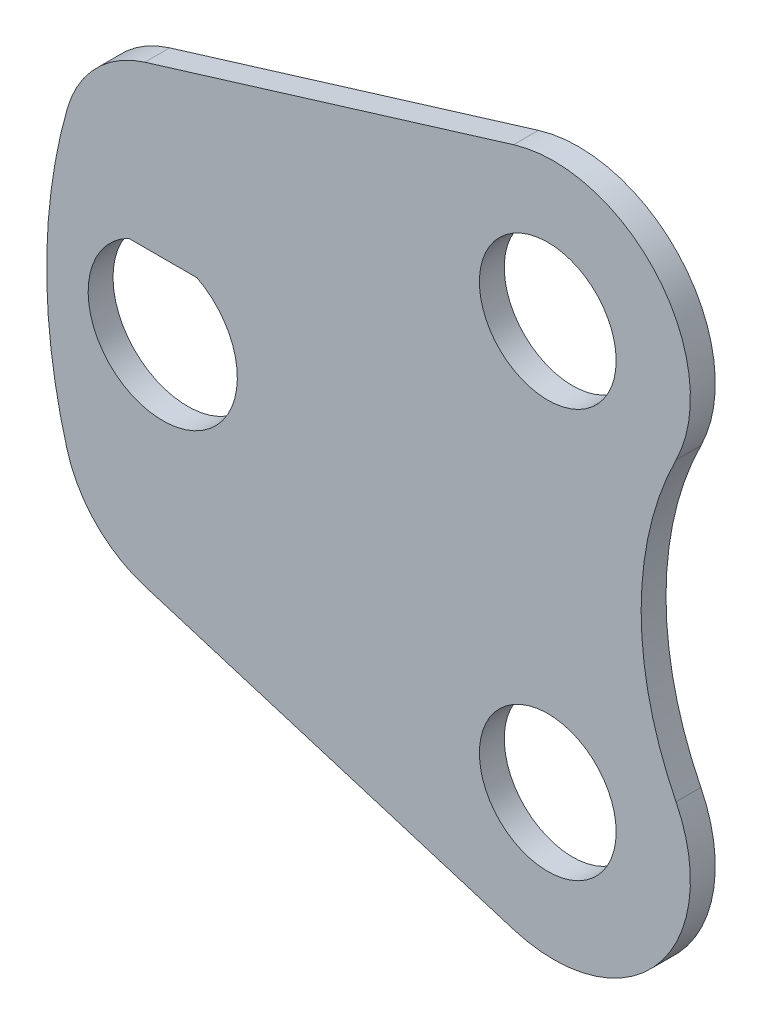
ISO-10303-21;
HEADER;
FILE_DESCRIPTION(('STEP AP214'),'2;1');
FILE_NAME('part.step','',(''),(''),'','','');
FILE_SCHEMA(('AUTOMOTIVE_DESIGN { 1 0 10303 214 1 1 1 1 }'));
ENDSEC;
DATA;
#1=APPLICATION_CONTEXT('core data for automotive mechanical design processes');
#2=APPLICATION_PROTOCOL_DEFINITION('international standard','automotive_design',2000,#1);
#3=PRODUCT_CONTEXT('',#1,'mechanical');
#4=PRODUCT('Part','Part','',(#3));
#5=PRODUCT_RELATED_PRODUCT_CATEGORY('part','',(#4));
#6=PRODUCT_DEFINITION_FORMATION('','',#4);
#7=PRODUCT_DEFINITION_CONTEXT('part definition',#1,'design');
#8=PRODUCT_DEFINITION('design','',#6,#7);
#9=PRODUCT_DEFINITION_SHAPE('','',#8);
#10=(LENGTH_UNIT() NAMED_UNIT(*) SI_UNIT(.MILLI.,.METRE.));
#11=(NAMED_UNIT(*) PLANE_ANGLE_UNIT() SI_UNIT($,.RADIAN.));
#12=(NAMED_UNIT(*) SI_UNIT($,.STERADIAN.) SOLID_ANGLE_UNIT());
#13=UNCERTAINTY_MEASURE_WITH_UNIT(LENGTH_MEASURE(1.E-05),#10,'distance_accuracy_value','');
#14=(GEOMETRIC_REPRESENTATION_CONTEXT(3) GLOBAL_UNCERTAINTY_ASSIGNED_CONTEXT((#13)) GLOBAL_UNIT_ASSIGNED_CONTEXT((#10,
#11,#12)) REPRESENTATION_CONTEXT('',''));
#15=CARTESIAN_POINT('',(0.,0.,0.));
#16=DIRECTION('',(0.,0.,1.));
#17=DIRECTION('',(1.,0.,0.));
#18=AXIS2_PLACEMENT_3D('',#15,#16,#17);
#19=CARTESIAN_POINT('',(-2.17060222083509,-12.6116644131444,1.49999999999999));
#20=DIRECTION('',(0.,0.,1.));
#21=DIRECTION('',(1.,0.,0.));
#22=AXIS2_PLACEMENT_3D('',#19,#20,#21);
#23=PLANE('',#22);
#24=CARTESIAN_POINT('',(-2.52417284795119,-12.3099999999997,1.49999999999999));
#25=DIRECTION('',(0.,0.,1.));
#26=DIRECTION('',(1.,0.,0.));
#27=AXIS2_PLACEMENT_3D('',#24,#25,#26);
#28=CIRCLE('',#27,4.125);
#29=CARTESIAN_POINT('',(1.60082715204881,-12.3099999999997,1.49999999999999));
#30=VERTEX_POINT('',#29);
#31=EDGE_CURVE('E140',#30,#30,#28,.T.);
#32=ORIENTED_EDGE('',*,*,#31,.F.);
#33=EDGE_LOOP('',(#32));
#34=FACE_BOUND('',#33,.T.);
#35=CARTESIAN_POINT('',(-2.52417284795097,12.3099999999992,1.5));
#36=DIRECTION('',(0.,0.,1.));
#37=DIRECTION('',(1.,0.,0.));
#38=AXIS2_PLACEMENT_3D('',#35,#36,#37);
#39=CIRCLE('',#38,4.125);
#40=CARTESIAN_POINT('',(1.60082715204903,12.3099999999992,1.5));
#41=VERTEX_POINT('',#40);
#42=EDGE_CURVE('E200',#41,#41,#39,.T.);
#43=ORIENTED_EDGE('',*,*,#42,.F.);
#44=EDGE_LOOP('',(#43));
#45=FACE_BOUND('',#44,.T.);
#46=CARTESIAN_POINT('',(-2.17060222083509,-12.6116644131444,1.49999999999999));
#47=DIRECTION('',(0.,0.,1.));
#48=DIRECTION('',(1.,0.,0.));
#49=AXIS2_PLACEMENT_3D('',#46,#47,#48);
#50=CIRCLE('',#49,8.25000000000008);
#51=CARTESIAN_POINT('',(-4.5865206112494,-20.5000000000005,1.5));
#52=VERTEX_POINT('',#51);
#53=CARTESIAN_POINT('',(5.21164843393354,-8.92861197390747,1.5));
#54=VERTEX_POINT('',#53);
#55=EDGE_CURVE('E146',#52,#54,#50,.T.);
#56=ORIENTED_EDGE('',*,*,#55,.T.);
#57=CARTESIAN_POINT('',(23.1080136576146,0.,1.5));
#58=DIRECTION('',(0.,0.,-1.));
#59=DIRECTION('',(1.,0.,0.));
#60=AXIS2_PLACEMENT_3D('',#57,#58,#59);
#61=CIRCLE('',#60,19.9999999999996);
#62=CARTESIAN_POINT('',(5.21164843393334,8.92861197390705,1.5));
#63=VERTEX_POINT('',#62);
#64=EDGE_CURVE('E149',#54,#63,#61,.T.);
#65=ORIENTED_EDGE('',*,*,#64,.T.);
#66=CARTESIAN_POINT('',(-2.17060222083512,12.6116644131437,1.5));
#67=DIRECTION('',(0.,0.,1.));
#68=DIRECTION('',(1.,0.,0.));
#69=AXIS2_PLACEMENT_3D('',#66,#67,#68);
#70=CIRCLE('',#69,8.24999999999978);
#71=CARTESIAN_POINT('',(-4.58652061124899,20.4999999999995,1.5));
#72=VERTEX_POINT('',#71);
#73=EDGE_CURVE('E152',#63,#72,#70,.T.);
#74=ORIENTED_EDGE('',*,*,#73,.T.);
#75=DIRECTION('',(-0.956161889315886,-0.292838592777447,0.));
#76=VECTOR('',#75,1.);
#77=CARTESIAN_POINT('',(-4.58652061124899,20.4999999999995,1.5));
#78=LINE('',#77,#76);
#79=CARTESIAN_POINT('',(-26.8318768792062,13.687033599506,1.5));
#80=VERTEX_POINT('',#79);
#81=EDGE_CURVE('E154',#72,#80,#78,.T.);
#82=ORIENTED_EDGE('',*,*,#81,.T.);
#83=CARTESIAN_POINT('',(-24.7820067297636,6.9939003742932,1.5));
#84=DIRECTION('',(0.,0.,1.));
#85=DIRECTION('',(1.,0.,0.));
#86=AXIS2_PLACEMENT_3D('',#83,#84,#85);
#87=CIRCLE('',#86,7.00000000000167);
#88=CARTESIAN_POINT('',(-31.5188629281496,8.89515484497591,1.5));
#89=VERTEX_POINT('',#88);
#90=EDGE_CURVE('E156',#80,#89,#87,.T.);
#91=ORIENTED_EDGE('',*,*,#90,.T.);
#92=CARTESIAN_POINT('',(0.,0.,1.5));
#93=DIRECTION('',(0.,0.,1.));
#94=DIRECTION('',(1.,0.,0.));
#95=AXIS2_PLACEMENT_3D('',#92,#93,#94);
#96=CIRCLE('',#95,32.7499999999936);
#97=CARTESIAN_POINT('',(-31.5188629281496,-8.89515484497587,1.5));
#98=VERTEX_POINT('',#97);
#99=EDGE_CURVE('E158',#89,#98,#96,.T.);
#100=ORIENTED_EDGE('',*,*,#99,.T.);
#101=CARTESIAN_POINT('',(-24.7820067297636,-6.99390037429318,1.50000000000002));
#102=DIRECTION('',(0.,0.,1.));
#103=DIRECTION('',(1.,0.,0.));
#104=AXIS2_PLACEMENT_3D('',#101,#102,#103);
#105=CIRCLE('',#104,7.00000000000168);
#106=CARTESIAN_POINT('',(-26.8318768792065,-13.6870335995059,1.50000000000002));
#107=VERTEX_POINT('',#106);
#108=EDGE_CURVE('E160',#98,#107,#105,.T.);
#109=ORIENTED_EDGE('',*,*,#108,.T.);
#110=DIRECTION('',(0.956161889315873,-0.292838592777489,0.));
#111=VECTOR('',#110,1.);
#112=CARTESIAN_POINT('',(-26.8318768792065,-13.6870335995059,1.50000000000002));
#113=LINE('',#112,#111);
#114=EDGE_CURVE('E162',#107,#52,#113,.T.);
#115=ORIENTED_EDGE('',*,*,#114,.T.);
#116=EDGE_LOOP('',(#56,#65,#74,#82,#91,#100,#109,#115));
#117=FACE_BOUND('',#116,.T.);
#118=DIRECTION('',(-1.,0.,0.));
#119=VECTOR('',#118,1.);
#120=CARTESIAN_POINT('',(-23.6884471871796,3.99999999999727,1.50000000000002));
#121=LINE('',#120,#119);
#122=CARTESIAN_POINT('',(-23.6884471871796,3.99999999999727,1.50000000000002));
#123=VERTEX_POINT('',#122);
#124=CARTESIAN_POINT('',(-27.8115528128083,3.99999999999727,1.5));
#125=VERTEX_POINT('',#124);
#126=EDGE_CURVE('E126',#123,#125,#121,.T.);
#127=ORIENTED_EDGE('',*,*,#126,.F.);
#128=CARTESIAN_POINT('',(-25.749999999994,0.,1.5));
#129=DIRECTION('',(0.,0.,1.));
#130=DIRECTION('',(1.,0.,0.));
#131=AXIS2_PLACEMENT_3D('',#128,#129,#130);
#132=CIRCLE('',#131,4.50000000000011);
#133=EDGE_CURVE('E132',#125,#123,#132,.T.);
#134=ORIENTED_EDGE('',*,*,#133,.F.);
#135=EDGE_LOOP('',(#127,#134));
#136=FACE_BOUND('',#135,.T.);
#137=ADVANCED_FACE('F48',(#34,#45,#117,#136),#23,.T.);
#138=CARTESIAN_POINT('',(-2.17060222083509,-12.6116644131444,0.));
#139=DIRECTION('',(0.,0.,1.));
#140=DIRECTION('',(1.,0.,0.));
#141=AXIS2_PLACEMENT_3D('',#138,#139,#140);
#142=PLANE('',#141);
#143=CARTESIAN_POINT('',(-2.5241728479512,-12.3099999999997,0.));
#144=DIRECTION('',(0.,0.,1.));
#145=DIRECTION('',(1.,0.,0.));
#146=AXIS2_PLACEMENT_3D('',#143,#144,#145);
#147=CIRCLE('',#146,4.125);
#148=CARTESIAN_POINT('',(1.6008271520488,-12.3099999999997,0.));
#149=VERTEX_POINT('',#148);
#150=EDGE_CURVE('E52',#149,#149,#147,.T.);
#151=ORIENTED_EDGE('',*,*,#150,.T.);
#152=EDGE_LOOP('',(#151));
#153=FACE_BOUND('',#152,.T.);
#154=CARTESIAN_POINT('',(-2.52417284795097,12.3099999999991,0.));
#155=DIRECTION('',(0.,0.,1.));
#156=DIRECTION('',(1.,0.,0.));
#157=AXIS2_PLACEMENT_3D('',#154,#155,#156);
#158=CIRCLE('',#157,4.125);
#159=CARTESIAN_POINT('',(1.60082715204903,12.3099999999991,0.));
#160=VERTEX_POINT('',#159);
#161=EDGE_CURVE('E198',#160,#160,#158,.T.);
#162=ORIENTED_EDGE('',*,*,#161,.T.);
#163=EDGE_LOOP('',(#162));
#164=FACE_BOUND('',#163,.T.);
#165=CARTESIAN_POINT('',(-2.17060222083509,-12.6116644131444,0.));
#166=DIRECTION('',(0.,0.,1.));
#167=DIRECTION('',(1.,0.,0.));
#168=AXIS2_PLACEMENT_3D('',#165,#166,#167);
#169=CIRCLE('',#168,8.25000000000008);
#170=CARTESIAN_POINT('',(-4.5865206112494,-20.5000000000005,0.));
#171=VERTEX_POINT('',#170);
#172=CARTESIAN_POINT('',(5.21164843393354,-8.92861197390747,0.));
#173=VERTEX_POINT('',#172);
#174=EDGE_CURVE('E145',#171,#173,#169,.T.);
#175=ORIENTED_EDGE('',*,*,#174,.F.);
#176=DIRECTION('',(0.956161889315873,-0.292838592777489,0.));
#177=VECTOR('',#176,1.);
#178=CARTESIAN_POINT('',(-26.8318768792065,-13.6870335995059,0.));
#179=LINE('',#178,#177);
#180=CARTESIAN_POINT('',(-26.8318768792065,-13.6870335995059,0.));
#181=VERTEX_POINT('',#180);
#182=EDGE_CURVE('E150',#181,#171,#179,.T.);
#183=ORIENTED_EDGE('',*,*,#182,.F.);
#184=CARTESIAN_POINT('',(-24.7820067297636,-6.99390037429318,0.));
#185=DIRECTION('',(0.,0.,1.));
#186=DIRECTION('',(1.,0.,0.));
#187=AXIS2_PLACEMENT_3D('',#184,#185,#186);
#188=CIRCLE('',#187,7.00000000000168);
#189=CARTESIAN_POINT('',(-31.5188629281496,-8.89515484497587,0.));
#190=VERTEX_POINT('',#189);
#191=EDGE_CURVE('E177',#190,#181,#188,.T.);
#192=ORIENTED_EDGE('',*,*,#191,.F.);
#193=CARTESIAN_POINT('',(0.,0.,0.));
#194=DIRECTION('',(0.,0.,1.));
#195=DIRECTION('',(1.,0.,0.));
#196=AXIS2_PLACEMENT_3D('',#193,#194,#195);
#197=CIRCLE('',#196,32.7499999999936);
#198=CARTESIAN_POINT('',(-31.5188629281496,8.89515484497591,0.));
#199=VERTEX_POINT('',#198);
#200=EDGE_CURVE('E175',#199,#190,#197,.T.);
#201=ORIENTED_EDGE('',*,*,#200,.F.);
#202=CARTESIAN_POINT('',(-24.7820067297636,6.9939003742932,0.));
#203=DIRECTION('',(0.,0.,1.));
#204=DIRECTION('',(1.,0.,0.));
#205=AXIS2_PLACEMENT_3D('',#202,#203,#204);
#206=CIRCLE('',#205,7.00000000000167);
#207=CARTESIAN_POINT('',(-26.8318768792062,13.687033599506,0.));
#208=VERTEX_POINT('',#207);
#209=EDGE_CURVE('E173',#208,#199,#206,.T.);
#210=ORIENTED_EDGE('',*,*,#209,.F.);
#211=DIRECTION('',(-0.956161889315886,-0.292838592777447,0.));
#212=VECTOR('',#211,1.);
#213=CARTESIAN_POINT('',(-4.58652061124899,20.4999999999996,0.));
#214=LINE('',#213,#212);
#215=CARTESIAN_POINT('',(-4.58652061124899,20.4999999999996,0.));
#216=VERTEX_POINT('',#215);
#217=EDGE_CURVE('E171',#216,#208,#214,.T.);
#218=ORIENTED_EDGE('',*,*,#217,.F.);
#219=CARTESIAN_POINT('',(-2.17060222083512,12.6116644131437,0.));
#220=DIRECTION('',(0.,0.,1.));
#221=DIRECTION('',(1.,0.,0.));
#222=AXIS2_PLACEMENT_3D('',#219,#220,#221);
#223=CIRCLE('',#222,8.24999999999978);
#224=CARTESIAN_POINT('',(5.21164843393334,8.92861197390705,0.));
#225=VERTEX_POINT('',#224);
#226=EDGE_CURVE('E169',#225,#216,#223,.T.);
#227=ORIENTED_EDGE('',*,*,#226,.F.);
#228=CARTESIAN_POINT('',(23.1080136576146,0.,0.));
#229=DIRECTION('',(0.,0.,-1.));
#230=DIRECTION('',(1.,0.,0.));
#231=AXIS2_PLACEMENT_3D('',#228,#229,#230);
#232=CIRCLE('',#231,19.9999999999996);
#233=EDGE_CURVE('E167',#173,#225,#232,.T.);
#234=ORIENTED_EDGE('',*,*,#233,.F.);
#235=EDGE_LOOP('',(#175,#183,#192,#201,#210,#218,#227,#234));
#236=FACE_BOUND('',#235,.T.);
#237=CARTESIAN_POINT('',(-25.749999999994,0.,0.));
#238=DIRECTION('',(0.,0.,1.));
#239=DIRECTION('',(1.,0.,0.));
#240=AXIS2_PLACEMENT_3D('',#237,#238,#239);
#241=CIRCLE('',#240,4.50000000000011);
#242=CARTESIAN_POINT('',(-27.8115528128083,3.99999999999727,0.));
#243=VERTEX_POINT('',#242);
#244=CARTESIAN_POINT('',(-23.6884471871796,3.99999999999727,0.));
#245=VERTEX_POINT('',#244);
#246=EDGE_CURVE('E72',#243,#245,#241,.T.);
#247=ORIENTED_EDGE('',*,*,#246,.T.);
#248=DIRECTION('',(-1.,0.,0.));
#249=VECTOR('',#248,1.);
#250=CARTESIAN_POINT('',(-23.6884471871796,3.99999999999727,0.));
#251=LINE('',#250,#249);
#252=EDGE_CURVE('E136',#245,#243,#251,.T.);
#253=ORIENTED_EDGE('',*,*,#252,.T.);
#254=EDGE_LOOP('',(#247,#253));
#255=FACE_BOUND('',#254,.T.);
#256=ADVANCED_FACE('F217',(#153,#164,#236,#255),#142,.F.);
#257=CARTESIAN_POINT('',(-2.17060222083509,-12.6116644131444,1.49999999999999));
#258=DIRECTION('',(0.,0.,-1.));
#259=DIRECTION('',(-1.,0.,0.));
#260=AXIS2_PLACEMENT_3D('',#257,#258,#259);
#261=CYLINDRICAL_SURFACE('',#260,8.25000000000008);
#262=ORIENTED_EDGE('',*,*,#174,.T.);
#263=DIRECTION('',(0.,0.,-1.));
#264=VECTOR('',#263,1.);
#265=CARTESIAN_POINT('',(5.21164843393354,-8.92861197390747,1.5));
#266=LINE('',#265,#264);
#267=EDGE_CURVE('E13',#54,#173,#266,.T.);
#268=ORIENTED_EDGE('',*,*,#267,.F.);
#269=ORIENTED_EDGE('',*,*,#55,.F.);
#270=DIRECTION('',(0.,0.,-1.));
#271=VECTOR('',#270,1.);
#272=CARTESIAN_POINT('',(-4.5865206112494,-20.5000000000005,1.5));
#273=LINE('',#272,#271);
#274=EDGE_CURVE('E164',#52,#171,#273,.T.);
#275=ORIENTED_EDGE('',*,*,#274,.T.);
#276=EDGE_LOOP('',(#262,#268,#269,#275));
#277=FACE_BOUND('',#276,.T.);
#278=ADVANCED_FACE('F50',(#277),#261,.T.);
#279=CARTESIAN_POINT('',(23.1080136576146,0.,1.5));
#280=DIRECTION('',(0.,0.,-1.));
#281=DIRECTION('',(-1.,0.,0.));
#282=AXIS2_PLACEMENT_3D('',#279,#280,#281);
#283=CYLINDRICAL_SURFACE('',#282,19.9999999999996);
#284=ORIENTED_EDGE('',*,*,#233,.T.);
#285=DIRECTION('',(0.,0.,-1.));
#286=VECTOR('',#285,1.);
#287=CARTESIAN_POINT('',(5.21164843393334,8.92861197390705,1.5));
#288=LINE('',#287,#286);
#289=EDGE_CURVE('E57',#63,#225,#288,.T.);
#290=ORIENTED_EDGE('',*,*,#289,.F.);
#291=ORIENTED_EDGE('',*,*,#64,.F.);
#292=ORIENTED_EDGE('',*,*,#267,.T.);
#293=EDGE_LOOP('',(#284,#290,#291,#292));
#294=FACE_BOUND('',#293,.T.);
#295=ADVANCED_FACE('F228',(#294),#283,.F.);
#296=CARTESIAN_POINT('',(-2.17060222083512,12.6116644131437,1.5));
#297=DIRECTION('',(0.,0.,-1.));
#298=DIRECTION('',(-1.,0.,0.));
#299=AXIS2_PLACEMENT_3D('',#296,#297,#298);
#300=CYLINDRICAL_SURFACE('',#299,8.24999999999978);
#301=ORIENTED_EDGE('',*,*,#226,.T.);
#302=DIRECTION('',(0.,0.,-1.));
#303=VECTOR('',#302,1.);
#304=CARTESIAN_POINT('',(-4.58652061124899,20.4999999999995,1.5));
#305=LINE('',#304,#303);
#306=EDGE_CURVE('E194',#72,#216,#305,.T.);
#307=ORIENTED_EDGE('',*,*,#306,.F.);
#308=ORIENTED_EDGE('',*,*,#73,.F.);
#309=ORIENTED_EDGE('',*,*,#289,.T.);
#310=EDGE_LOOP('',(#301,#307,#308,#309));
#311=FACE_BOUND('',#310,.T.);
#312=ADVANCED_FACE('F233',(#311),#300,.T.);
#313=CARTESIAN_POINT('',(-4.58652061124899,20.4999999999995,1.5));
#314=DIRECTION('',(0.292838592777448,-0.956161889315886,0.));
#315=DIRECTION('',(0.956161889315886,0.292838592777448,0.));
#316=AXIS2_PLACEMENT_3D('',#313,#314,#315);
#317=PLANE('',#316);
#318=ORIENTED_EDGE('',*,*,#217,.T.);
#319=DIRECTION('',(0.,0.,-1.));
#320=VECTOR('',#319,1.);
#321=CARTESIAN_POINT('',(-26.8318768792062,13.687033599506,1.5));
#322=LINE('',#321,#320);
#323=EDGE_CURVE('E191',#80,#208,#322,.T.);
#324=ORIENTED_EDGE('',*,*,#323,.F.);
#325=ORIENTED_EDGE('',*,*,#81,.F.);
#326=ORIENTED_EDGE('',*,*,#306,.T.);
#327=EDGE_LOOP('',(#318,#324,#325,#326));
#328=FACE_BOUND('',#327,.T.);
#329=ADVANCED_FACE('F239',(#328),#317,.F.);
#330=CARTESIAN_POINT('',(-24.7820067297636,6.9939003742932,1.5));
#331=DIRECTION('',(0.,0.,-1.));
#332=DIRECTION('',(-1.,0.,0.));
#333=AXIS2_PLACEMENT_3D('',#330,#331,#332);
#334=CYLINDRICAL_SURFACE('',#333,7.00000000000167);
#335=ORIENTED_EDGE('',*,*,#209,.T.);
#336=DIRECTION('',(0.,0.,-1.));
#337=VECTOR('',#336,1.);
#338=CARTESIAN_POINT('',(-31.5188629281496,8.89515484497591,1.5));
#339=LINE('',#338,#337);
#340=EDGE_CURVE('E188',#89,#199,#339,.T.);
#341=ORIENTED_EDGE('',*,*,#340,.F.);
#342=ORIENTED_EDGE('',*,*,#90,.F.);
#343=ORIENTED_EDGE('',*,*,#323,.T.);
#344=EDGE_LOOP('',(#335,#341,#342,#343));
#345=FACE_BOUND('',#344,.T.);
#346=ADVANCED_FACE('F243',(#345),#334,.T.);
#347=CARTESIAN_POINT('',(0.,0.,1.5));
#348=DIRECTION('',(0.,0.,-1.));
#349=DIRECTION('',(-1.,0.,0.));
#350=AXIS2_PLACEMENT_3D('',#347,#348,#349);
#351=CYLINDRICAL_SURFACE('',#350,32.7499999999936);
#352=ORIENTED_EDGE('',*,*,#200,.T.);
#353=DIRECTION('',(0.,0.,-1.));
#354=VECTOR('',#353,1.);
#355=CARTESIAN_POINT('',(-31.5188629281496,-8.89515484497587,1.5));
#356=LINE('',#355,#354);
#357=EDGE_CURVE('E185',#98,#190,#356,.T.);
#358=ORIENTED_EDGE('',*,*,#357,.F.);
#359=ORIENTED_EDGE('',*,*,#99,.F.);
#360=ORIENTED_EDGE('',*,*,#340,.T.);
#361=EDGE_LOOP('',(#352,#358,#359,#360));
#362=FACE_BOUND('',#361,.T.);
#363=ADVANCED_FACE('F248',(#362),#351,.T.);
#364=CARTESIAN_POINT('',(-24.7820067297636,-6.99390037429318,1.50000000000002));
#365=DIRECTION('',(0.,0.,-1.));
#366=DIRECTION('',(-1.,0.,0.));
#367=AXIS2_PLACEMENT_3D('',#364,#365,#366);
#368=CYLINDRICAL_SURFACE('',#367,7.00000000000168);
#369=ORIENTED_EDGE('',*,*,#191,.T.);
#370=DIRECTION('',(0.,0.,-1.));
#371=VECTOR('',#370,1.);
#372=CARTESIAN_POINT('',(-26.8318768792065,-13.6870335995059,1.50000000000002));
#373=LINE('',#372,#371);
#374=EDGE_CURVE('E182',#107,#181,#373,.T.);
#375=ORIENTED_EDGE('',*,*,#374,.F.);
#376=ORIENTED_EDGE('',*,*,#108,.F.);
#377=ORIENTED_EDGE('',*,*,#357,.T.);
#378=EDGE_LOOP('',(#369,#375,#376,#377));
#379=FACE_BOUND('',#378,.T.);
#380=ADVANCED_FACE('F252',(#379),#368,.T.);
#381=CARTESIAN_POINT('',(-26.8318768792065,-13.6870335995059,1.50000000000002));
#382=DIRECTION('',(0.292838592777489,0.956161889315873,0.));
#383=DIRECTION('',(-0.956161889315873,0.292838592777489,0.));
#384=AXIS2_PLACEMENT_3D('',#381,#382,#383);
#385=PLANE('',#384);
#386=ORIENTED_EDGE('',*,*,#182,.T.);
#387=ORIENTED_EDGE('',*,*,#274,.F.);
#388=ORIENTED_EDGE('',*,*,#114,.F.);
#389=ORIENTED_EDGE('',*,*,#374,.T.);
#390=EDGE_LOOP('',(#386,#387,#388,#389));
#391=FACE_BOUND('',#390,.T.);
#392=ADVANCED_FACE('F256',(#391),#385,.F.);
#393=CARTESIAN_POINT('',(-25.749999999994,0.,1.5));
#394=DIRECTION('',(0.,0.,-1.));
#395=DIRECTION('',(-1.,0.,0.));
#396=AXIS2_PLACEMENT_3D('',#393,#394,#395);
#397=CYLINDRICAL_SURFACE('',#396,4.50000000000011);
#398=ORIENTED_EDGE('',*,*,#246,.F.);
#399=DIRECTION('',(0.,0.,-1.));
#400=VECTOR('',#399,1.);
#401=CARTESIAN_POINT('',(-27.8115528128083,3.99999999999727,1.5));
#402=LINE('',#401,#400);
#403=EDGE_CURVE('E128',#125,#243,#402,.T.);
#404=ORIENTED_EDGE('',*,*,#403,.F.);
#405=ORIENTED_EDGE('',*,*,#133,.T.);
#406=DIRECTION('',(0.,0.,-1.));
#407=VECTOR('',#406,1.);
#408=CARTESIAN_POINT('',(-23.6884471871796,3.99999999999727,1.50000000000002));
#409=LINE('',#408,#407);
#410=EDGE_CURVE('E65',#123,#245,#409,.T.);
#411=ORIENTED_EDGE('',*,*,#410,.T.);
#412=EDGE_LOOP('',(#398,#404,#405,#411));
#413=FACE_BOUND('',#412,.T.);
#414=ADVANCED_FACE('F134',(#413),#397,.F.);
#415=CARTESIAN_POINT('',(-23.6884471871796,3.99999999999727,1.50000000000002));
#416=DIRECTION('',(0.,-1.,0.));
#417=DIRECTION('',(0.,0.,-1.));
#418=AXIS2_PLACEMENT_3D('',#415,#416,#417);
#419=PLANE('',#418);
#420=ORIENTED_EDGE('',*,*,#252,.F.);
#421=ORIENTED_EDGE('',*,*,#410,.F.);
#422=ORIENTED_EDGE('',*,*,#126,.T.);
#423=ORIENTED_EDGE('',*,*,#403,.T.);
#424=EDGE_LOOP('',(#420,#421,#422,#423));
#425=FACE_BOUND('',#424,.T.);
#426=ADVANCED_FACE('F127',(#425),#419,.T.);
#427=CARTESIAN_POINT('',(-2.52417284795096,12.3099999999991,5.));
#428=DIRECTION('',(0.,0.,-1.));
#429=DIRECTION('',(-1.,0.,0.));
#430=AXIS2_PLACEMENT_3D('',#427,#428,#429);
#431=CYLINDRICAL_SURFACE('',#430,4.125);
#432=ORIENTED_EDGE('',*,*,#42,.T.);
#433=EDGE_LOOP('',(#432));
#434=FACE_BOUND('',#433,.T.);
#435=ORIENTED_EDGE('',*,*,#161,.F.);
#436=EDGE_LOOP('',(#435));
#437=FACE_BOUND('',#436,.T.);
#438=ADVANCED_FACE('F317',(#434,#437),#431,.F.);
#439=CARTESIAN_POINT('',(-2.5241728479512,-12.3099999999997,5.));
#440=DIRECTION('',(0.,0.,-1.));
#441=DIRECTION('',(-1.,0.,0.));
#442=AXIS2_PLACEMENT_3D('',#439,#440,#441);
#443=CYLINDRICAL_SURFACE('',#442,4.125);
#444=ORIENTED_EDGE('',*,*,#31,.T.);
#445=EDGE_LOOP('',(#444));
#446=FACE_BOUND('',#445,.T.);
#447=ORIENTED_EDGE('',*,*,#150,.F.);
#448=EDGE_LOOP('',(#447));
#449=FACE_BOUND('',#448,.T.);
#450=ADVANCED_FACE('F212',(#446,#449),#443,.F.);
#451=CLOSED_SHELL('',(#137,#256,#278,#295,#312,#329,#346,#363,#380,#392,#414,#426,#438,#450));
#452=MANIFOLD_SOLID_BREP('B2',#451);
#453=ADVANCED_BREP_SHAPE_REPRESENTATION('',(#18,#452),#14);
#454=SHAPE_DEFINITION_REPRESENTATION(#9,#453);
ENDSEC;
END-ISO-10303-21;
